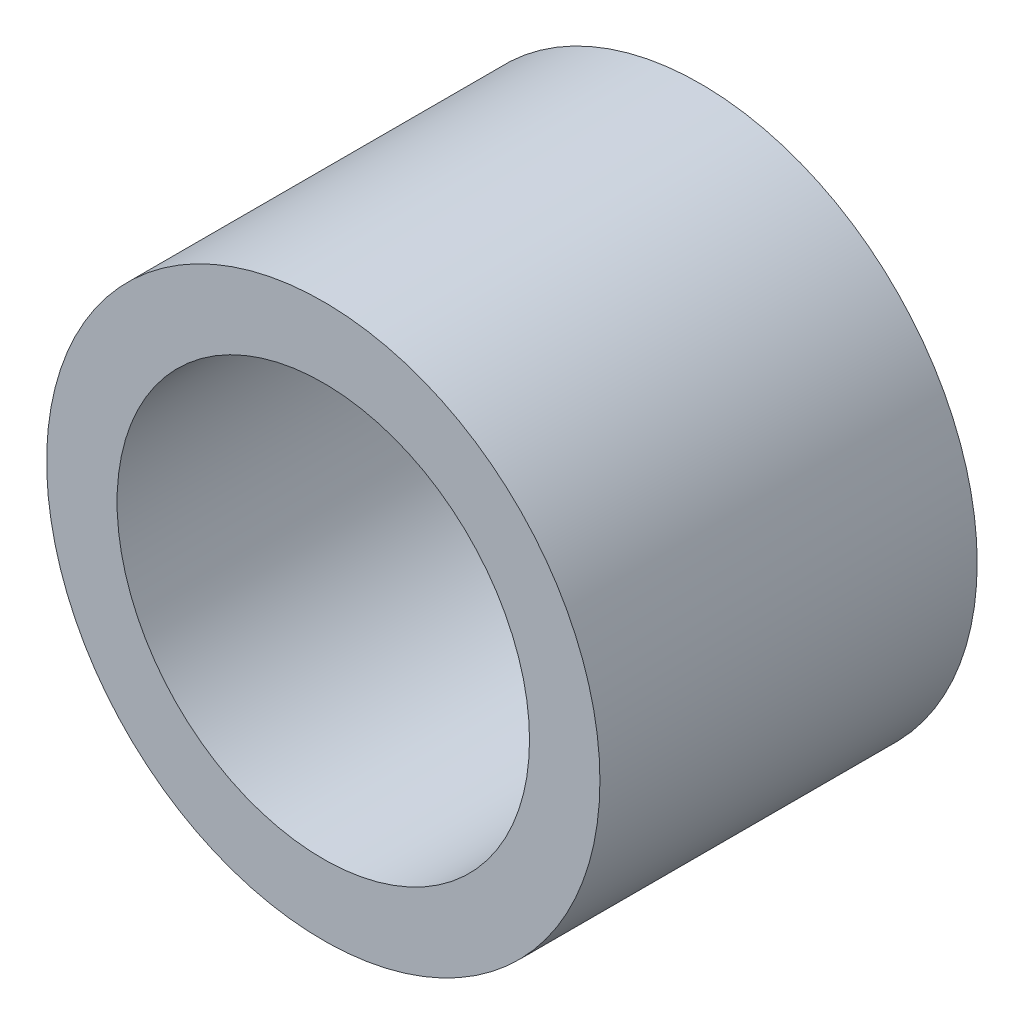
ISO-10303-21;
HEADER;
FILE_DESCRIPTION(('STEP AP214'),'2;1');
FILE_NAME('part.step','',(''),(''),'','','');
FILE_SCHEMA(('AUTOMOTIVE_DESIGN { 1 0 10303 214 1 1 1 1 }'));
ENDSEC;
DATA;
#1=APPLICATION_CONTEXT('core data for automotive mechanical design processes');
#2=APPLICATION_PROTOCOL_DEFINITION('international standard','automotive_design',2000,#1);
#3=PRODUCT_CONTEXT('',#1,'mechanical');
#4=PRODUCT('Part','Part','',(#3));
#5=PRODUCT_RELATED_PRODUCT_CATEGORY('part','',(#4));
#6=PRODUCT_DEFINITION_FORMATION('','',#4);
#7=PRODUCT_DEFINITION_CONTEXT('part definition',#1,'design');
#8=PRODUCT_DEFINITION('design','',#6,#7);
#9=PRODUCT_DEFINITION_SHAPE('','',#8);
#10=(LENGTH_UNIT() NAMED_UNIT(*) SI_UNIT(.MILLI.,.METRE.));
#11=(NAMED_UNIT(*) PLANE_ANGLE_UNIT() SI_UNIT($,.RADIAN.));
#12=(NAMED_UNIT(*) SI_UNIT($,.STERADIAN.) SOLID_ANGLE_UNIT());
#13=UNCERTAINTY_MEASURE_WITH_UNIT(LENGTH_MEASURE(1.E-05),#10,'distance_accuracy_value','');
#14=(GEOMETRIC_REPRESENTATION_CONTEXT(3) GLOBAL_UNCERTAINTY_ASSIGNED_CONTEXT((#13)) GLOBAL_UNIT_ASSIGNED_CONTEXT((#10,
#11,#12)) REPRESENTATION_CONTEXT('',''));
#15=CARTESIAN_POINT('',(0.,0.,0.));
#16=DIRECTION('',(0.,0.,1.));
#17=DIRECTION('',(1.,0.,0.));
#18=AXIS2_PLACEMENT_3D('',#15,#16,#17);
#19=CARTESIAN_POINT('',(0.,0.,7.5));
#20=DIRECTION('',(0.,0.,1.));
#21=DIRECTION('',(1.,0.,0.));
#22=AXIS2_PLACEMENT_3D('',#19,#20,#21);
#23=PLANE('',#22);
#24=CARTESIAN_POINT('',(0.,0.,7.5));
#25=DIRECTION('',(0.,0.,1.));
#26=DIRECTION('',(1.,0.,0.));
#27=AXIS2_PLACEMENT_3D('',#24,#25,#26);
#28=CIRCLE('',#27,5.5);
#29=CARTESIAN_POINT('',(5.5,0.,7.5));
#30=VERTEX_POINT('',#29);
#31=EDGE_CURVE('E10',#30,#30,#28,.T.);
#32=ORIENTED_EDGE('',*,*,#31,.T.);
#33=EDGE_LOOP('',(#32));
#34=FACE_BOUND('',#33,.T.);
#35=CARTESIAN_POINT('',(0.,0.,7.5));
#36=DIRECTION('',(0.,0.,1.));
#37=DIRECTION('',(1.,0.,0.));
#38=AXIS2_PLACEMENT_3D('',#35,#36,#37);
#39=CIRCLE('',#38,4.1);
#40=CARTESIAN_POINT('',(4.1,0.,7.5));
#41=VERTEX_POINT('',#40);
#42=EDGE_CURVE('E56',#41,#41,#39,.T.);
#43=ORIENTED_EDGE('',*,*,#42,.F.);
#44=EDGE_LOOP('',(#43));
#45=FACE_BOUND('',#44,.T.);
#46=ADVANCED_FACE('F43',(#34,#45),#23,.T.);
#47=CARTESIAN_POINT('',(0.,0.,0.));
#48=DIRECTION('',(0.,0.,1.));
#49=DIRECTION('',(1.,0.,0.));
#50=AXIS2_PLACEMENT_3D('',#47,#48,#49);
#51=PLANE('',#50);
#52=CARTESIAN_POINT('',(0.,0.,0.));
#53=DIRECTION('',(0.,0.,1.));
#54=DIRECTION('',(1.,0.,0.));
#55=AXIS2_PLACEMENT_3D('',#52,#53,#54);
#56=CIRCLE('',#55,5.5);
#57=CARTESIAN_POINT('',(5.5,0.,0.));
#58=VERTEX_POINT('',#57);
#59=EDGE_CURVE('E47',#58,#58,#56,.T.);
#60=ORIENTED_EDGE('',*,*,#59,.F.);
#61=EDGE_LOOP('',(#60));
#62=FACE_BOUND('',#61,.T.);
#63=CARTESIAN_POINT('',(0.,0.,0.));
#64=DIRECTION('',(0.,0.,1.));
#65=DIRECTION('',(1.,0.,0.));
#66=AXIS2_PLACEMENT_3D('',#63,#64,#65);
#67=CIRCLE('',#66,4.1);
#68=CARTESIAN_POINT('',(4.1,0.,0.));
#69=VERTEX_POINT('',#68);
#70=EDGE_CURVE('E58',#69,#69,#67,.T.);
#71=ORIENTED_EDGE('',*,*,#70,.T.);
#72=EDGE_LOOP('',(#71));
#73=FACE_BOUND('',#72,.T.);
#74=ADVANCED_FACE('F70',(#62,#73),#51,.F.);
#75=CARTESIAN_POINT('',(0.,0.,7.5));
#76=DIRECTION('',(0.,0.,-1.));
#77=DIRECTION('',(-1.,0.,0.));
#78=AXIS2_PLACEMENT_3D('',#75,#76,#77);
#79=CYLINDRICAL_SURFACE('',#78,5.5);
#80=ORIENTED_EDGE('',*,*,#31,.F.);
#81=EDGE_LOOP('',(#80));
#82=FACE_BOUND('',#81,.T.);
#83=ORIENTED_EDGE('',*,*,#59,.T.);
#84=EDGE_LOOP('',(#83));
#85=FACE_BOUND('',#84,.T.);
#86=ADVANCED_FACE('F45',(#82,#85),#79,.T.);
#87=CARTESIAN_POINT('',(0.,0.,7.5));
#88=DIRECTION('',(0.,0.,-1.));
#89=DIRECTION('',(-1.,0.,0.));
#90=AXIS2_PLACEMENT_3D('',#87,#88,#89);
#91=CYLINDRICAL_SURFACE('',#90,4.1);
#92=ORIENTED_EDGE('',*,*,#42,.T.);
#93=EDGE_LOOP('',(#92));
#94=FACE_BOUND('',#93,.T.);
#95=ORIENTED_EDGE('',*,*,#70,.F.);
#96=EDGE_LOOP('',(#95));
#97=FACE_BOUND('',#96,.T.);
#98=ADVANCED_FACE('F66',(#94,#97),#91,.F.);
#99=CLOSED_SHELL('',(#46,#74,#86,#98));
#100=MANIFOLD_SOLID_BREP('B2',#99);
#101=ADVANCED_BREP_SHAPE_REPRESENTATION('',(#18,#100),#14);
#102=SHAPE_DEFINITION_REPRESENTATION(#9,#101);
ENDSEC;
END-ISO-10303-21;
